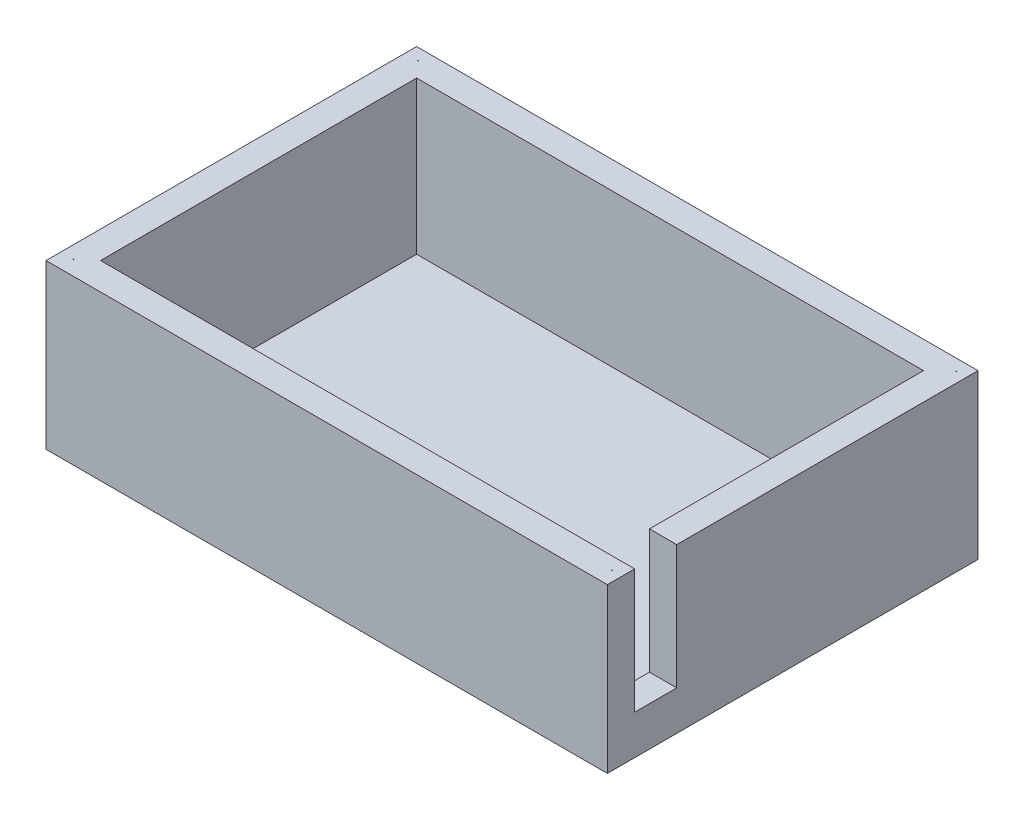
ISO-10303-21;
HEADER;
FILE_DESCRIPTION(('STEP AP214'),'2;1');
FILE_NAME('part.step','',(''),(''),'','','');
FILE_SCHEMA(('AUTOMOTIVE_DESIGN { 1 0 10303 214 1 1 1 1 }'));
ENDSEC;
DATA;
#1=APPLICATION_CONTEXT('core data for automotive mechanical design processes');
#2=APPLICATION_PROTOCOL_DEFINITION('international standard','automotive_design',2000,#1);
#3=PRODUCT_CONTEXT('',#1,'mechanical');
#4=PRODUCT('Part','Part','',(#3));
#5=PRODUCT_RELATED_PRODUCT_CATEGORY('part','',(#4));
#6=PRODUCT_DEFINITION_FORMATION('','',#4);
#7=PRODUCT_DEFINITION_CONTEXT('part definition',#1,'design');
#8=PRODUCT_DEFINITION('design','',#6,#7);
#9=PRODUCT_DEFINITION_SHAPE('','',#8);
#10=(LENGTH_UNIT() NAMED_UNIT(*) SI_UNIT(.MILLI.,.METRE.));
#11=(NAMED_UNIT(*) PLANE_ANGLE_UNIT() SI_UNIT($,.RADIAN.));
#12=(NAMED_UNIT(*) SI_UNIT($,.STERADIAN.) SOLID_ANGLE_UNIT());
#13=UNCERTAINTY_MEASURE_WITH_UNIT(LENGTH_MEASURE(1.E-05),#10,'distance_accuracy_value','');
#14=(GEOMETRIC_REPRESENTATION_CONTEXT(3) GLOBAL_UNCERTAINTY_ASSIGNED_CONTEXT((#13)) GLOBAL_UNIT_ASSIGNED_CONTEXT((#10,
#11,#12)) REPRESENTATION_CONTEXT('',''));
#15=CARTESIAN_POINT('',(0.,0.,0.));
#16=DIRECTION('',(0.,0.,1.));
#17=DIRECTION('',(1.,0.,0.));
#18=AXIS2_PLACEMENT_3D('',#15,#16,#17);
#19=CARTESIAN_POINT('',(0.,30.,0.));
#20=DIRECTION('',(0.,1.,0.));
#21=DIRECTION('',(0.,0.,1.));
#22=AXIS2_PLACEMENT_3D('',#19,#20,#21);
#23=PLANE('',#22);
#24=CARTESIAN_POINT('',(49.1302612898892,30.,30.5503355917267));
#25=DIRECTION('',(0.,1.,0.));
#26=DIRECTION('',(0.,0.,1.));
#27=AXIS2_PLACEMENT_3D('',#24,#25,#26);
#28=CIRCLE('',#27,0.0749300000000008);
#29=CARTESIAN_POINT('',(49.1302612898892,30.,30.6252655917267));
#30=VERTEX_POINT('',#29);
#31=EDGE_CURVE('E411',#30,#30,#28,.T.);
#32=ORIENTED_EDGE('',*,*,#31,.F.);
#33=EDGE_LOOP('',(#32));
#34=FACE_BOUND('',#33,.T.);
#35=CARTESIAN_POINT('',(49.1302612898892,30.,-32.6240258038411));
#36=DIRECTION('',(0.,1.,0.));
#37=DIRECTION('',(0.,0.,1.));
#38=AXIS2_PLACEMENT_3D('',#35,#36,#37);
#39=CIRCLE('',#38,0.0749300000000008);
#40=CARTESIAN_POINT('',(49.1302612898892,30.,-32.549095803841));
#41=VERTEX_POINT('',#40);
#42=EDGE_CURVE('E413',#41,#41,#39,.T.);
#43=ORIENTED_EDGE('',*,*,#42,.F.);
#44=EDGE_LOOP('',(#43));
#45=FACE_BOUND('',#44,.T.);
#46=CARTESIAN_POINT('',(-49.6512564399296,30.,-32.6240258038411));
#47=DIRECTION('',(0.,1.,0.));
#48=DIRECTION('',(0.,0.,1.));
#49=AXIS2_PLACEMENT_3D('',#46,#47,#48);
#50=CIRCLE('',#49,0.0749300000000008);
#51=CARTESIAN_POINT('',(-49.6512564399296,30.,-32.549095803841));
#52=VERTEX_POINT('',#51);
#53=EDGE_CURVE('E421',#52,#52,#50,.T.);
#54=ORIENTED_EDGE('',*,*,#53,.F.);
#55=EDGE_LOOP('',(#54));
#56=FACE_BOUND('',#55,.T.);
#57=CARTESIAN_POINT('',(-49.6512564399296,30.,30.5503355917267));
#58=DIRECTION('',(0.,1.,0.));
#59=DIRECTION('',(0.,0.,1.));
#60=AXIS2_PLACEMENT_3D('',#57,#58,#59);
#61=CIRCLE('',#60,0.0749300000000008);
#62=CARTESIAN_POINT('',(-49.6512564399296,30.,30.6252655917267));
#63=VERTEX_POINT('',#62);
#64=EDGE_CURVE('E427',#63,#63,#61,.T.);
#65=ORIENTED_EDGE('',*,*,#64,.F.);
#66=EDGE_LOOP('',(#65));
#67=FACE_BOUND('',#66,.T.);
#68=DIRECTION('',(1.,0.,0.));
#69=VECTOR('',#68,1.);
#70=CARTESIAN_POINT('',(22.9999999999877,30.,28.2394087793349));
#71=LINE('',#70,#69);
#72=CARTESIAN_POINT('',(45.9951555332339,30.,28.2394087793349));
#73=VERTEX_POINT('',#72);
#74=CARTESIAN_POINT('',(50.9999999999877,30.,28.2394087793349));
#75=VERTEX_POINT('',#74);
#76=EDGE_CURVE('E139',#73,#75,#71,.T.);
#77=ORIENTED_EDGE('',*,*,#76,.F.);
#78=DIRECTION('',(0.,0.,1.));
#79=VECTOR('',#78,1.);
#80=CARTESIAN_POINT('',(45.9951555332339,30.,-29.7537057556951));
#81=LINE('',#80,#79);
#82=CARTESIAN_POINT('',(45.9951555332339,30.,28.2450643676384));
#83=VERTEX_POINT('',#82);
#84=EDGE_CURVE('E170',#73,#83,#81,.T.);
#85=ORIENTED_EDGE('',*,*,#84,.T.);
#86=DIRECTION('',(-1.,0.,0.));
#87=VECTOR('',#86,1.);
#88=CARTESIAN_POINT('',(-47.000426977192,30.,28.2450643676384));
#89=LINE('',#88,#87);
#90=CARTESIAN_POINT('',(-47.000426977192,30.,28.2450643676384));
#91=VERTEX_POINT('',#90);
#92=EDGE_CURVE('E159',#83,#91,#89,.T.);
#93=ORIENTED_EDGE('',*,*,#92,.T.);
#94=DIRECTION('',(0.,0.,-1.));
#95=VECTOR('',#94,1.);
#96=CARTESIAN_POINT('',(-47.000426977192,30.,-29.7537057556951));
#97=LINE('',#96,#95);
#98=CARTESIAN_POINT('',(-47.000426977192,30.,-29.7537057556951));
#99=VERTEX_POINT('',#98);
#100=EDGE_CURVE('E58',#91,#99,#97,.T.);
#101=ORIENTED_EDGE('',*,*,#100,.T.);
#102=DIRECTION('',(1.,0.,0.));
#103=VECTOR('',#102,1.);
#104=CARTESIAN_POINT('',(-47.000426977192,30.,-29.7537057556951));
#105=LINE('',#104,#103);
#106=CARTESIAN_POINT('',(45.9951555332339,30.,-29.7537057556951));
#107=VERTEX_POINT('',#106);
#108=EDGE_CURVE('E167',#99,#107,#105,.T.);
#109=ORIENTED_EDGE('',*,*,#108,.T.);
#110=CARTESIAN_POINT('',(45.9951555332339,30.,20.5269874485561));
#111=VERTEX_POINT('',#110);
#112=EDGE_CURVE('E171',#107,#111,#81,.T.);
#113=ORIENTED_EDGE('',*,*,#112,.T.);
#114=DIRECTION('',(1.,0.,0.));
#115=VECTOR('',#114,1.);
#116=CARTESIAN_POINT('',(22.9999999999877,30.,20.5269874485561));
#117=LINE('',#116,#115);
#118=CARTESIAN_POINT('',(50.9999999999877,30.,20.5269874485561));
#119=VERTEX_POINT('',#118);
#120=EDGE_CURVE('E151',#111,#119,#117,.T.);
#121=ORIENTED_EDGE('',*,*,#120,.T.);
#122=DIRECTION('',(0.,0.,-1.));
#123=VECTOR('',#122,1.);
#124=CARTESIAN_POINT('',(50.9999999999877,30.,-34.7499999999741));
#125=LINE('',#124,#123);
#126=CARTESIAN_POINT('',(50.9999999999877,30.,-34.7499999999741));
#127=VERTEX_POINT('',#126);
#128=EDGE_CURVE('E188',#119,#127,#125,.T.);
#129=ORIENTED_EDGE('',*,*,#128,.T.);
#130=DIRECTION('',(-1.,0.,0.));
#131=VECTOR('',#130,1.);
#132=CARTESIAN_POINT('',(-52.0000000000209,30.,-34.7499999999741));
#133=LINE('',#132,#131);
#134=CARTESIAN_POINT('',(-52.0000000000209,30.,-34.7499999999741));
#135=VERTEX_POINT('',#134);
#136=EDGE_CURVE('E187',#127,#135,#133,.T.);
#137=ORIENTED_EDGE('',*,*,#136,.T.);
#138=DIRECTION('',(0.,0.,1.));
#139=VECTOR('',#138,1.);
#140=CARTESIAN_POINT('',(-52.0000000000209,30.,-34.7499999999741));
#141=LINE('',#140,#139);
#142=CARTESIAN_POINT('',(-52.0000000000209,30.,33.2500000001801));
#143=VERTEX_POINT('',#142);
#144=EDGE_CURVE('E190',#135,#143,#141,.T.);
#145=ORIENTED_EDGE('',*,*,#144,.T.);
#146=DIRECTION('',(1.,0.,0.));
#147=VECTOR('',#146,1.);
#148=CARTESIAN_POINT('',(-52.0000000000209,30.,33.2500000001801));
#149=LINE('',#148,#147);
#150=CARTESIAN_POINT('',(50.9999999999877,30.,33.2500000001801));
#151=VERTEX_POINT('',#150);
#152=EDGE_CURVE('E192',#143,#151,#149,.T.);
#153=ORIENTED_EDGE('',*,*,#152,.T.);
#154=EDGE_CURVE('E185',#151,#75,#125,.T.);
#155=ORIENTED_EDGE('',*,*,#154,.T.);
#156=EDGE_LOOP('',(#77,#85,#93,#101,#109,#113,#121,#129,#137,#145,#153,#155));
#157=FACE_BOUND('',#156,.T.);
#158=ADVANCED_FACE('F35',(#34,#45,#56,#67,#157),#23,.T.);
#159=CARTESIAN_POINT('',(50.9999999999877,30.,-34.7499999999741));
#160=DIRECTION('',(-1.,0.,0.));
#161=DIRECTION('',(0.,0.,1.));
#162=AXIS2_PLACEMENT_3D('',#159,#160,#161);
#163=PLANE('',#162);
#164=DIRECTION('',(0.,0.,-1.));
#165=VECTOR('',#164,1.);
#166=CARTESIAN_POINT('',(50.9999999999877,7.23423028446746,28.2394087793349));
#167=LINE('',#166,#165);
#168=CARTESIAN_POINT('',(50.9999999999877,7.23423028446746,28.2394087793349));
#169=VERTEX_POINT('',#168);
#170=CARTESIAN_POINT('',(50.9999999999877,7.23423028446746,20.5269874485561));
#171=VERTEX_POINT('',#170);
#172=EDGE_CURVE('E127',#169,#171,#167,.T.);
#173=ORIENTED_EDGE('',*,*,#172,.F.);
#174=DIRECTION('',(0.,-1.,0.));
#175=VECTOR('',#174,1.);
#176=CARTESIAN_POINT('',(50.9999999999877,30.,28.2394087793349));
#177=LINE('',#176,#175);
#178=EDGE_CURVE('E136',#75,#169,#177,.T.);
#179=ORIENTED_EDGE('',*,*,#178,.F.);
#180=ORIENTED_EDGE('',*,*,#154,.F.);
#181=DIRECTION('',(0.,-1.,0.));
#182=VECTOR('',#181,1.);
#183=CARTESIAN_POINT('',(50.9999999999877,30.,33.2500000001801));
#184=LINE('',#183,#182);
#185=CARTESIAN_POINT('',(50.9999999999877,0.,33.2500000001801));
#186=VERTEX_POINT('',#185);
#187=EDGE_CURVE('E194',#151,#186,#184,.T.);
#188=ORIENTED_EDGE('',*,*,#187,.T.);
#189=DIRECTION('',(0.,0.,-1.));
#190=VECTOR('',#189,1.);
#191=CARTESIAN_POINT('',(50.9999999999877,0.,-34.7499999999741));
#192=LINE('',#191,#190);
#193=CARTESIAN_POINT('',(50.9999999999877,0.,-34.7499999999741));
#194=VERTEX_POINT('',#193);
#195=EDGE_CURVE('E184',#186,#194,#192,.T.);
#196=ORIENTED_EDGE('',*,*,#195,.T.);
#197=DIRECTION('',(0.,-1.,0.));
#198=VECTOR('',#197,1.);
#199=CARTESIAN_POINT('',(50.9999999999877,30.,-34.7499999999741));
#200=LINE('',#199,#198);
#201=EDGE_CURVE('E211',#127,#194,#200,.T.);
#202=ORIENTED_EDGE('',*,*,#201,.F.);
#203=ORIENTED_EDGE('',*,*,#128,.F.);
#204=DIRECTION('',(0.,1.,0.));
#205=VECTOR('',#204,1.);
#206=CARTESIAN_POINT('',(50.9999999999877,30.,20.5269874485561));
#207=LINE('',#206,#205);
#208=EDGE_CURVE('E133',#171,#119,#207,.T.);
#209=ORIENTED_EDGE('',*,*,#208,.F.);
#210=EDGE_LOOP('',(#173,#179,#180,#188,#196,#202,#203,#209));
#211=FACE_BOUND('',#210,.T.);
#212=ADVANCED_FACE('F37',(#211),#163,.F.);
#213=CARTESIAN_POINT('',(-52.0000000000209,30.,-34.7499999999741));
#214=DIRECTION('',(0.,0.,1.));
#215=DIRECTION('',(1.,0.,0.));
#216=AXIS2_PLACEMENT_3D('',#213,#214,#215);
#217=PLANE('',#216);
#218=DIRECTION('',(-1.,0.,0.));
#219=VECTOR('',#218,1.);
#220=CARTESIAN_POINT('',(-52.0000000000209,0.,-34.7499999999741));
#221=LINE('',#220,#219);
#222=CARTESIAN_POINT('',(-52.0000000000209,0.,-34.7499999999741));
#223=VERTEX_POINT('',#222);
#224=EDGE_CURVE('E197',#194,#223,#221,.T.);
#225=ORIENTED_EDGE('',*,*,#224,.T.);
#226=DIRECTION('',(0.,-1.,0.));
#227=VECTOR('',#226,1.);
#228=CARTESIAN_POINT('',(-52.0000000000209,30.,-34.7499999999741));
#229=LINE('',#228,#227);
#230=EDGE_CURVE('E208',#135,#223,#229,.T.);
#231=ORIENTED_EDGE('',*,*,#230,.F.);
#232=ORIENTED_EDGE('',*,*,#136,.F.);
#233=ORIENTED_EDGE('',*,*,#201,.T.);
#234=EDGE_LOOP('',(#225,#231,#232,#233));
#235=FACE_BOUND('',#234,.T.);
#236=ADVANCED_FACE('F234',(#235),#217,.F.);
#237=CARTESIAN_POINT('',(-52.0000000000209,30.,-34.7499999999741));
#238=DIRECTION('',(1.,0.,0.));
#239=DIRECTION('',(0.,0.,-1.));
#240=AXIS2_PLACEMENT_3D('',#237,#238,#239);
#241=PLANE('',#240);
#242=DIRECTION('',(0.,0.,1.));
#243=VECTOR('',#242,1.);
#244=CARTESIAN_POINT('',(-52.0000000000209,0.,-34.7499999999741));
#245=LINE('',#244,#243);
#246=CARTESIAN_POINT('',(-52.0000000000209,0.,33.2500000001801));
#247=VERTEX_POINT('',#246);
#248=EDGE_CURVE('E199',#223,#247,#245,.T.);
#249=ORIENTED_EDGE('',*,*,#248,.T.);
#250=DIRECTION('',(0.,-1.,0.));
#251=VECTOR('',#250,1.);
#252=CARTESIAN_POINT('',(-52.0000000000209,30.,33.2500000001801));
#253=LINE('',#252,#251);
#254=EDGE_CURVE('E205',#143,#247,#253,.T.);
#255=ORIENTED_EDGE('',*,*,#254,.F.);
#256=ORIENTED_EDGE('',*,*,#144,.F.);
#257=ORIENTED_EDGE('',*,*,#230,.T.);
#258=EDGE_LOOP('',(#249,#255,#256,#257));
#259=FACE_BOUND('',#258,.T.);
#260=ADVANCED_FACE('F272',(#259),#241,.F.);
#261=CARTESIAN_POINT('',(-52.0000000000209,30.,33.2500000001801));
#262=DIRECTION('',(0.,0.,-1.));
#263=DIRECTION('',(-1.,0.,0.));
#264=AXIS2_PLACEMENT_3D('',#261,#262,#263);
#265=PLANE('',#264);
#266=DIRECTION('',(1.,0.,0.));
#267=VECTOR('',#266,1.);
#268=CARTESIAN_POINT('',(-52.0000000000209,0.,33.2500000001801));
#269=LINE('',#268,#267);
#270=EDGE_CURVE('E201',#247,#186,#269,.T.);
#271=ORIENTED_EDGE('',*,*,#270,.T.);
#272=ORIENTED_EDGE('',*,*,#187,.F.);
#273=ORIENTED_EDGE('',*,*,#152,.F.);
#274=ORIENTED_EDGE('',*,*,#254,.T.);
#275=EDGE_LOOP('',(#271,#272,#273,#274));
#276=FACE_BOUND('',#275,.T.);
#277=ADVANCED_FACE('F268',(#276),#265,.F.);
#278=CARTESIAN_POINT('',(0.,0.,0.));
#279=DIRECTION('',(0.,1.,0.));
#280=DIRECTION('',(0.,0.,1.));
#281=AXIS2_PLACEMENT_3D('',#278,#279,#280);
#282=PLANE('',#281);
#283=CARTESIAN_POINT('',(49.1302612898892,0.,30.5503355917267));
#284=DIRECTION('',(0.,1.,0.));
#285=DIRECTION('',(0.,0.,1.));
#286=AXIS2_PLACEMENT_3D('',#283,#284,#285);
#287=CIRCLE('',#286,0.0749299999999939);
#288=CARTESIAN_POINT('',(49.1302612898892,0.,30.6252655917267));
#289=VERTEX_POINT('',#288);
#290=EDGE_CURVE('E409',#289,#289,#287,.T.);
#291=ORIENTED_EDGE('',*,*,#290,.T.);
#292=EDGE_LOOP('',(#291));
#293=FACE_BOUND('',#292,.T.);
#294=CARTESIAN_POINT('',(49.1302612898892,0.,-32.6240258038411));
#295=DIRECTION('',(0.,1.,0.));
#296=DIRECTION('',(0.,0.,1.));
#297=AXIS2_PLACEMENT_3D('',#294,#295,#296);
#298=CIRCLE('',#297,0.0749299999999939);
#299=CARTESIAN_POINT('',(49.1302612898892,0.,-32.5490958038411));
#300=VERTEX_POINT('',#299);
#301=EDGE_CURVE('E418',#300,#300,#298,.T.);
#302=ORIENTED_EDGE('',*,*,#301,.T.);
#303=EDGE_LOOP('',(#302));
#304=FACE_BOUND('',#303,.T.);
#305=CARTESIAN_POINT('',(-49.6512564399296,0.,-32.6240258038411));
#306=DIRECTION('',(0.,1.,0.));
#307=DIRECTION('',(0.,0.,1.));
#308=AXIS2_PLACEMENT_3D('',#305,#306,#307);
#309=CIRCLE('',#308,0.0749299999999939);
#310=CARTESIAN_POINT('',(-49.6512564399296,0.,-32.5490958038411));
#311=VERTEX_POINT('',#310);
#312=EDGE_CURVE('E424',#311,#311,#309,.T.);
#313=ORIENTED_EDGE('',*,*,#312,.T.);
#314=EDGE_LOOP('',(#313));
#315=FACE_BOUND('',#314,.T.);
#316=CARTESIAN_POINT('',(-49.6512564399296,0.,30.5503355917267));
#317=DIRECTION('',(0.,1.,0.));
#318=DIRECTION('',(0.,0.,1.));
#319=AXIS2_PLACEMENT_3D('',#316,#317,#318);
#320=CIRCLE('',#319,0.0749299999999939);
#321=CARTESIAN_POINT('',(-49.6512564399296,0.,30.6252655917267));
#322=VERTEX_POINT('',#321);
#323=EDGE_CURVE('E143',#322,#322,#320,.T.);
#324=ORIENTED_EDGE('',*,*,#323,.T.);
#325=EDGE_LOOP('',(#324));
#326=FACE_BOUND('',#325,.T.);
#327=ORIENTED_EDGE('',*,*,#195,.F.);
#328=ORIENTED_EDGE('',*,*,#270,.F.);
#329=ORIENTED_EDGE('',*,*,#248,.F.);
#330=ORIENTED_EDGE('',*,*,#224,.F.);
#331=EDGE_LOOP('',(#327,#328,#329,#330));
#332=FACE_BOUND('',#331,.T.);
#333=ADVANCED_FACE('F229',(#293,#304,#315,#326,#332),#282,.F.);
#334=CARTESIAN_POINT('',(-47.000426977192,1.99999999999999,-29.7537057556951));
#335=DIRECTION('',(1.,0.,0.));
#336=DIRECTION('',(0.,0.,-1.));
#337=AXIS2_PLACEMENT_3D('',#334,#335,#336);
#338=PLANE('',#337);
#339=ORIENTED_EDGE('',*,*,#100,.F.);
#340=DIRECTION('',(0.,1.,0.));
#341=VECTOR('',#340,1.);
#342=CARTESIAN_POINT('',(-47.000426977192,1.99999999999999,28.2450643676384));
#343=LINE('',#342,#341);
#344=CARTESIAN_POINT('',(-47.000426977192,1.99999999999999,28.2450643676384));
#345=VERTEX_POINT('',#344);
#346=EDGE_CURVE('E165',#345,#91,#343,.T.);
#347=ORIENTED_EDGE('',*,*,#346,.F.);
#348=DIRECTION('',(0.,0.,-1.));
#349=VECTOR('',#348,1.);
#350=CARTESIAN_POINT('',(-47.000426977192,1.99999999999999,-29.7537057556951));
#351=LINE('',#350,#349);
#352=CARTESIAN_POINT('',(-47.000426977192,1.99999999999999,-29.7537057556951));
#353=VERTEX_POINT('',#352);
#354=EDGE_CURVE('E155',#345,#353,#351,.T.);
#355=ORIENTED_EDGE('',*,*,#354,.T.);
#356=DIRECTION('',(0.,1.,0.));
#357=VECTOR('',#356,1.);
#358=CARTESIAN_POINT('',(-47.000426977192,1.99999999999999,-29.7537057556951));
#359=LINE('',#358,#357);
#360=EDGE_CURVE('E182',#353,#99,#359,.T.);
#361=ORIENTED_EDGE('',*,*,#360,.T.);
#362=EDGE_LOOP('',(#339,#347,#355,#361));
#363=FACE_BOUND('',#362,.T.);
#364=ADVANCED_FACE('F246',(#363),#338,.T.);
#365=CARTESIAN_POINT('',(-47.000426977192,1.99999999999999,-29.7537057556951));
#366=DIRECTION('',(0.,0.,1.));
#367=DIRECTION('',(1.,0.,0.));
#368=AXIS2_PLACEMENT_3D('',#365,#366,#367);
#369=PLANE('',#368);
#370=ORIENTED_EDGE('',*,*,#108,.F.);
#371=ORIENTED_EDGE('',*,*,#360,.F.);
#372=DIRECTION('',(1.,0.,0.));
#373=VECTOR('',#372,1.);
#374=CARTESIAN_POINT('',(-47.000426977192,1.99999999999999,-29.7537057556951));
#375=LINE('',#374,#373);
#376=CARTESIAN_POINT('',(45.9951555332339,1.99999999999999,-29.7537057556951));
#377=VERTEX_POINT('',#376);
#378=EDGE_CURVE('E158',#353,#377,#375,.T.);
#379=ORIENTED_EDGE('',*,*,#378,.T.);
#380=DIRECTION('',(0.,1.,0.));
#381=VECTOR('',#380,1.);
#382=CARTESIAN_POINT('',(45.9951555332339,1.99999999999999,-29.7537057556951));
#383=LINE('',#382,#381);
#384=EDGE_CURVE('E180',#377,#107,#383,.T.);
#385=ORIENTED_EDGE('',*,*,#384,.T.);
#386=EDGE_LOOP('',(#370,#371,#379,#385));
#387=FACE_BOUND('',#386,.T.);
#388=ADVANCED_FACE('F248',(#387),#369,.T.);
#389=CARTESIAN_POINT('',(45.9951555332339,1.99999999999999,-29.7537057556951));
#390=DIRECTION('',(-1.,0.,0.));
#391=DIRECTION('',(0.,0.,1.));
#392=AXIS2_PLACEMENT_3D('',#389,#390,#391);
#393=PLANE('',#392);
#394=DIRECTION('',(0.,1.,0.));
#395=VECTOR('',#394,1.);
#396=CARTESIAN_POINT('',(45.9951555332339,1.99999999999998,28.2394087793349));
#397=LINE('',#396,#395);
#398=CARTESIAN_POINT('',(45.9951555332339,7.23423028446746,28.2394087793349));
#399=VERTEX_POINT('',#398);
#400=EDGE_CURVE('E11',#399,#73,#397,.T.);
#401=ORIENTED_EDGE('',*,*,#400,.F.);
#402=DIRECTION('',(0.,0.,1.));
#403=VECTOR('',#402,1.);
#404=CARTESIAN_POINT('',(45.9951555332339,7.23423028446746,-29.7537057556951));
#405=LINE('',#404,#403);
#406=CARTESIAN_POINT('',(45.9951555332339,7.23423028446746,20.5269874485561));
#407=VERTEX_POINT('',#406);
#408=EDGE_CURVE('E130',#407,#399,#405,.T.);
#409=ORIENTED_EDGE('',*,*,#408,.F.);
#410=DIRECTION('',(0.,-1.,0.));
#411=VECTOR('',#410,1.);
#412=CARTESIAN_POINT('',(45.9951555332339,1.99999999999999,20.5269874485561));
#413=LINE('',#412,#411);
#414=EDGE_CURVE('E43',#111,#407,#413,.T.);
#415=ORIENTED_EDGE('',*,*,#414,.F.);
#416=ORIENTED_EDGE('',*,*,#112,.F.);
#417=ORIENTED_EDGE('',*,*,#384,.F.);
#418=DIRECTION('',(0.,0.,1.));
#419=VECTOR('',#418,1.);
#420=CARTESIAN_POINT('',(45.9951555332339,1.99999999999999,-29.7537057556951));
#421=LINE('',#420,#419);
#422=CARTESIAN_POINT('',(45.9951555332339,1.99999999999999,28.2450643676384));
#423=VERTEX_POINT('',#422);
#424=EDGE_CURVE('E161',#377,#423,#421,.T.);
#425=ORIENTED_EDGE('',*,*,#424,.T.);
#426=DIRECTION('',(0.,1.,0.));
#427=VECTOR('',#426,1.);
#428=CARTESIAN_POINT('',(45.9951555332339,1.99999999999999,28.2450643676384));
#429=LINE('',#428,#427);
#430=EDGE_CURVE('E177',#423,#83,#429,.T.);
#431=ORIENTED_EDGE('',*,*,#430,.T.);
#432=ORIENTED_EDGE('',*,*,#84,.F.);
#433=EDGE_LOOP('',(#401,#409,#415,#416,#417,#425,#431,#432));
#434=FACE_BOUND('',#433,.T.);
#435=ADVANCED_FACE('F219',(#434),#393,.T.);
#436=CARTESIAN_POINT('',(-47.000426977192,1.99999999999999,28.2450643676384));
#437=DIRECTION('',(0.,0.,-1.));
#438=DIRECTION('',(-1.,0.,0.));
#439=AXIS2_PLACEMENT_3D('',#436,#437,#438);
#440=PLANE('',#439);
#441=ORIENTED_EDGE('',*,*,#92,.F.);
#442=ORIENTED_EDGE('',*,*,#430,.F.);
#443=DIRECTION('',(-1.,0.,0.));
#444=VECTOR('',#443,1.);
#445=CARTESIAN_POINT('',(-47.000426977192,1.99999999999999,28.2450643676384));
#446=LINE('',#445,#444);
#447=EDGE_CURVE('E163',#423,#345,#446,.T.);
#448=ORIENTED_EDGE('',*,*,#447,.T.);
#449=ORIENTED_EDGE('',*,*,#346,.T.);
#450=EDGE_LOOP('',(#441,#442,#448,#449));
#451=FACE_BOUND('',#450,.T.);
#452=ADVANCED_FACE('F245',(#451),#440,.T.);
#453=CARTESIAN_POINT('',(0.,1.99999999999999,0.));
#454=DIRECTION('',(0.,1.,0.));
#455=DIRECTION('',(0.,0.,1.));
#456=AXIS2_PLACEMENT_3D('',#453,#454,#455);
#457=PLANE('',#456);
#458=ORIENTED_EDGE('',*,*,#354,.F.);
#459=ORIENTED_EDGE('',*,*,#447,.F.);
#460=ORIENTED_EDGE('',*,*,#424,.F.);
#461=ORIENTED_EDGE('',*,*,#378,.F.);
#462=EDGE_LOOP('',(#458,#459,#460,#461));
#463=FACE_BOUND('',#462,.T.);
#464=ADVANCED_FACE('F242',(#463),#457,.T.);
#465=CARTESIAN_POINT('',(22.9999999999877,30.,28.2394087793349));
#466=DIRECTION('',(0.,0.,1.));
#467=DIRECTION('',(1.,0.,0.));
#468=AXIS2_PLACEMENT_3D('',#465,#466,#467);
#469=PLANE('',#468);
#470=ORIENTED_EDGE('',*,*,#400,.T.);
#471=ORIENTED_EDGE('',*,*,#76,.T.);
#472=ORIENTED_EDGE('',*,*,#178,.T.);
#473=DIRECTION('',(1.,0.,0.));
#474=VECTOR('',#473,1.);
#475=CARTESIAN_POINT('',(22.9999999999877,7.23423028446746,28.2394087793349));
#476=LINE('',#475,#474);
#477=EDGE_CURVE('E123',#399,#169,#476,.T.);
#478=ORIENTED_EDGE('',*,*,#477,.F.);
#479=EDGE_LOOP('',(#470,#471,#472,#478));
#480=FACE_BOUND('',#479,.T.);
#481=ADVANCED_FACE('F137',(#480),#469,.F.);
#482=CARTESIAN_POINT('',(22.9999999999877,30.,20.5269874485561));
#483=DIRECTION('',(0.,0.,-1.));
#484=DIRECTION('',(-1.,0.,0.));
#485=AXIS2_PLACEMENT_3D('',#482,#483,#484);
#486=PLANE('',#485);
#487=ORIENTED_EDGE('',*,*,#414,.T.);
#488=DIRECTION('',(1.,0.,0.));
#489=VECTOR('',#488,1.);
#490=CARTESIAN_POINT('',(22.9999999999877,7.23423028446746,20.5269874485561));
#491=LINE('',#490,#489);
#492=EDGE_CURVE('E50',#407,#171,#491,.T.);
#493=ORIENTED_EDGE('',*,*,#492,.T.);
#494=ORIENTED_EDGE('',*,*,#208,.T.);
#495=ORIENTED_EDGE('',*,*,#120,.F.);
#496=EDGE_LOOP('',(#487,#493,#494,#495));
#497=FACE_BOUND('',#496,.T.);
#498=ADVANCED_FACE('F216',(#497),#486,.F.);
#499=CARTESIAN_POINT('',(22.9999999999877,7.23423028446746,28.2394087793349));
#500=DIRECTION('',(0.,-1.,0.));
#501=DIRECTION('',(0.,0.,-1.));
#502=AXIS2_PLACEMENT_3D('',#499,#500,#501);
#503=PLANE('',#502);
#504=ORIENTED_EDGE('',*,*,#408,.T.);
#505=ORIENTED_EDGE('',*,*,#477,.T.);
#506=ORIENTED_EDGE('',*,*,#172,.T.);
#507=ORIENTED_EDGE('',*,*,#492,.F.);
#508=EDGE_LOOP('',(#504,#505,#506,#507));
#509=FACE_BOUND('',#508,.T.);
#510=ADVANCED_FACE('F125',(#509),#503,.F.);
#511=CARTESIAN_POINT('',(-49.6512564399296,30.,30.5503355917267));
#512=DIRECTION('',(0.,1.,0.));
#513=DIRECTION('',(0.,0.,1.));
#514=AXIS2_PLACEMENT_3D('',#511,#512,#513);
#515=CYLINDRICAL_SURFACE('',#514,0.0749299999999974);
#516=ORIENTED_EDGE('',*,*,#323,.F.);
#517=EDGE_LOOP('',(#516));
#518=FACE_BOUND('',#517,.T.);
#519=ORIENTED_EDGE('',*,*,#64,.T.);
#520=EDGE_LOOP('',(#519));
#521=FACE_BOUND('',#520,.T.);
#522=ADVANCED_FACE('F352',(#518,#521),#515,.F.);
#523=CARTESIAN_POINT('',(-49.6512564399296,30.,-32.6240258038411));
#524=DIRECTION('',(0.,1.,0.));
#525=DIRECTION('',(0.,0.,1.));
#526=AXIS2_PLACEMENT_3D('',#523,#524,#525);
#527=CYLINDRICAL_SURFACE('',#526,0.0749299999999974);
#528=ORIENTED_EDGE('',*,*,#312,.F.);
#529=EDGE_LOOP('',(#528));
#530=FACE_BOUND('',#529,.T.);
#531=ORIENTED_EDGE('',*,*,#53,.T.);
#532=EDGE_LOOP('',(#531));
#533=FACE_BOUND('',#532,.T.);
#534=ADVANCED_FACE('F372',(#530,#533),#527,.F.);
#535=CARTESIAN_POINT('',(49.1302612898892,30.,-32.6240258038411));
#536=DIRECTION('',(0.,1.,0.));
#537=DIRECTION('',(0.,0.,1.));
#538=AXIS2_PLACEMENT_3D('',#535,#536,#537);
#539=CYLINDRICAL_SURFACE('',#538,0.0749299999999974);
#540=ORIENTED_EDGE('',*,*,#301,.F.);
#541=EDGE_LOOP('',(#540));
#542=FACE_BOUND('',#541,.T.);
#543=ORIENTED_EDGE('',*,*,#42,.T.);
#544=EDGE_LOOP('',(#543));
#545=FACE_BOUND('',#544,.T.);
#546=ADVANCED_FACE('F379',(#542,#545),#539,.F.);
#547=CARTESIAN_POINT('',(49.1302612898892,30.,30.5503355917267));
#548=DIRECTION('',(0.,1.,0.));
#549=DIRECTION('',(0.,0.,1.));
#550=AXIS2_PLACEMENT_3D('',#547,#548,#549);
#551=CYLINDRICAL_SURFACE('',#550,0.0749299999999974);
#552=ORIENTED_EDGE('',*,*,#290,.F.);
#553=EDGE_LOOP('',(#552));
#554=FACE_BOUND('',#553,.T.);
#555=ORIENTED_EDGE('',*,*,#31,.T.);
#556=EDGE_LOOP('',(#555));
#557=FACE_BOUND('',#556,.T.);
#558=ADVANCED_FACE('F387',(#554,#557),#551,.F.);
#559=CLOSED_SHELL('',(#158,#212,#236,#260,#277,#333,#364,#388,#435,#452,#464,#481,#498,#510,
#522,#534,#546,#558));
#560=MANIFOLD_SOLID_BREP('B2',#559);
#561=ADVANCED_BREP_SHAPE_REPRESENTATION('',(#18,#560),#14);
#562=SHAPE_DEFINITION_REPRESENTATION(#9,#561);
ENDSEC;
END-ISO-10303-21;
